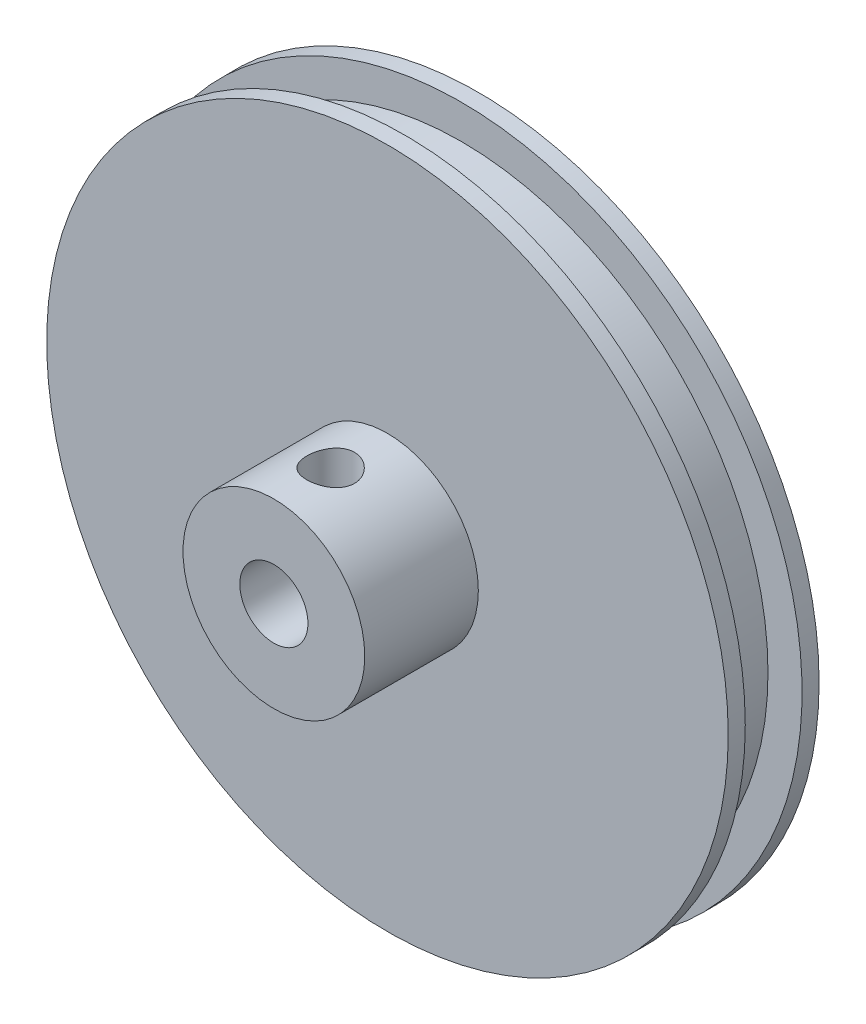
ISO-10303-21;
HEADER;
FILE_DESCRIPTION(('STEP AP214'),'2;1');
FILE_NAME('part.step','',(''),(''),'','','');
FILE_SCHEMA(('AUTOMOTIVE_DESIGN { 1 0 10303 214 1 1 1 1 }'));
ENDSEC;
DATA;
#1=APPLICATION_CONTEXT('core data for automotive mechanical design processes');
#2=APPLICATION_PROTOCOL_DEFINITION('international standard','automotive_design',2000,#1);
#3=PRODUCT_CONTEXT('',#1,'mechanical');
#4=PRODUCT('Part','Part','',(#3));
#5=PRODUCT_RELATED_PRODUCT_CATEGORY('part','',(#4));
#6=PRODUCT_DEFINITION_FORMATION('','',#4);
#7=PRODUCT_DEFINITION_CONTEXT('part definition',#1,'design');
#8=PRODUCT_DEFINITION('design','',#6,#7);
#9=PRODUCT_DEFINITION_SHAPE('','',#8);
#10=(LENGTH_UNIT() NAMED_UNIT(*) SI_UNIT(.MILLI.,.METRE.));
#11=(NAMED_UNIT(*) PLANE_ANGLE_UNIT() SI_UNIT($,.RADIAN.));
#12=(NAMED_UNIT(*) SI_UNIT($,.STERADIAN.) SOLID_ANGLE_UNIT());
#13=UNCERTAINTY_MEASURE_WITH_UNIT(LENGTH_MEASURE(1.E-05),#10,'distance_accuracy_value','');
#14=(GEOMETRIC_REPRESENTATION_CONTEXT(3) GLOBAL_UNCERTAINTY_ASSIGNED_CONTEXT((#13)) GLOBAL_UNIT_ASSIGNED_CONTEXT((#10,
#11,#12)) REPRESENTATION_CONTEXT('',''));
#15=CARTESIAN_POINT('',(0.,0.,0.));
#16=DIRECTION('',(0.,0.,1.));
#17=DIRECTION('',(1.,0.,0.));
#18=AXIS2_PLACEMENT_3D('',#15,#16,#17);
#19=CARTESIAN_POINT('',(0.,0.,8.));
#20=DIRECTION('',(0.,0.,-1.));
#21=DIRECTION('',(-1.,0.,0.));
#22=AXIS2_PLACEMENT_3D('',#19,#20,#21);
#23=CYLINDRICAL_SURFACE('',#22,30.);
#24=CARTESIAN_POINT('',(0.,0.,1.5));
#25=DIRECTION('',(0.,0.,-1.));
#26=DIRECTION('',(-1.,0.,0.));
#27=AXIS2_PLACEMENT_3D('',#24,#25,#26);
#28=CIRCLE('',#27,30.);
#29=CARTESIAN_POINT('',(-30.,0.,1.5));
#30=VERTEX_POINT('',#29);
#31=EDGE_CURVE('E53',#30,#30,#28,.T.);
#32=ORIENTED_EDGE('',*,*,#31,.T.);
#33=EDGE_LOOP('',(#32));
#34=FACE_BOUND('',#33,.T.);
#35=CARTESIAN_POINT('',(0.,0.,0.));
#36=DIRECTION('',(0.,0.,1.));
#37=DIRECTION('',(1.,0.,0.));
#38=AXIS2_PLACEMENT_3D('',#35,#36,#37);
#39=CIRCLE('',#38,30.);
#40=CARTESIAN_POINT('',(30.,0.,0.));
#41=VERTEX_POINT('',#40);
#42=EDGE_CURVE('E64',#41,#41,#39,.T.);
#43=ORIENTED_EDGE('',*,*,#42,.T.);
#44=EDGE_LOOP('',(#43));
#45=FACE_BOUND('',#44,.T.);
#46=ADVANCED_FACE('F49',(#34,#45),#23,.T.);
#47=CARTESIAN_POINT('',(0.,0.,6.5));
#48=DIRECTION('',(0.,0.,1.));
#49=DIRECTION('',(1.,0.,0.));
#50=AXIS2_PLACEMENT_3D('',#47,#48,#49);
#51=CIRCLE('',#50,30.);
#52=CARTESIAN_POINT('',(30.,0.,6.5));
#53=VERTEX_POINT('',#52);
#54=EDGE_CURVE('E72',#53,#53,#51,.T.);
#55=ORIENTED_EDGE('',*,*,#54,.T.);
#56=EDGE_LOOP('',(#55));
#57=FACE_BOUND('',#56,.T.);
#58=CARTESIAN_POINT('',(0.,0.,8.));
#59=DIRECTION('',(0.,0.,1.));
#60=DIRECTION('',(1.,0.,0.));
#61=AXIS2_PLACEMENT_3D('',#58,#59,#60);
#62=CIRCLE('',#61,30.);
#63=CARTESIAN_POINT('',(30.,0.,8.));
#64=VERTEX_POINT('',#63);
#65=EDGE_CURVE('E58',#64,#64,#62,.T.);
#66=ORIENTED_EDGE('',*,*,#65,.F.);
#67=EDGE_LOOP('',(#66));
#68=FACE_BOUND('',#67,.T.);
#69=ADVANCED_FACE('F51',(#57,#68),#23,.T.);
#70=CARTESIAN_POINT('',(0.,0.,8.));
#71=DIRECTION('',(0.,0.,1.));
#72=DIRECTION('',(1.,0.,0.));
#73=AXIS2_PLACEMENT_3D('',#70,#71,#72);
#74=PLANE('',#73);
#75=CARTESIAN_POINT('',(0.,0.,8.));
#76=DIRECTION('',(0.,0.,1.));
#77=DIRECTION('',(1.,0.,0.));
#78=AXIS2_PLACEMENT_3D('',#75,#76,#77);
#79=CIRCLE('',#78,8.);
#80=CARTESIAN_POINT('',(8.,0.,8.));
#81=VERTEX_POINT('',#80);
#82=EDGE_CURVE('E11',#81,#81,#79,.T.);
#83=ORIENTED_EDGE('',*,*,#82,.F.);
#84=EDGE_LOOP('',(#83));
#85=FACE_BOUND('',#84,.T.);
#86=ORIENTED_EDGE('',*,*,#65,.T.);
#87=EDGE_LOOP('',(#86));
#88=FACE_BOUND('',#87,.T.);
#89=ADVANCED_FACE('F133',(#85,#88),#74,.T.);
#90=CARTESIAN_POINT('',(0.,0.,0.));
#91=DIRECTION('',(0.,0.,1.));
#92=DIRECTION('',(1.,0.,0.));
#93=AXIS2_PLACEMENT_3D('',#90,#91,#92);
#94=PLANE('',#93);
#95=CARTESIAN_POINT('',(0.,0.,0.));
#96=DIRECTION('',(0.,0.,1.));
#97=DIRECTION('',(1.,0.,0.));
#98=AXIS2_PLACEMENT_3D('',#95,#96,#97);
#99=CIRCLE('',#98,3.);
#100=CARTESIAN_POINT('',(3.,0.,0.));
#101=VERTEX_POINT('',#100);
#102=EDGE_CURVE('E163',#101,#101,#99,.T.);
#103=ORIENTED_EDGE('',*,*,#102,.T.);
#104=EDGE_LOOP('',(#103));
#105=FACE_BOUND('',#104,.T.);
#106=ORIENTED_EDGE('',*,*,#42,.F.);
#107=EDGE_LOOP('',(#106));
#108=FACE_BOUND('',#107,.T.);
#109=ADVANCED_FACE('F138',(#105,#108),#94,.F.);
#110=CARTESIAN_POINT('',(0.,0.,18.));
#111=DIRECTION('',(0.,0.,-1.));
#112=DIRECTION('',(-1.,0.,0.));
#113=AXIS2_PLACEMENT_3D('',#110,#111,#112);
#114=CYLINDRICAL_SURFACE('',#113,8.);
#115=CARTESIAN_POINT('',(-2.10611885965794,7.71778876032463,13.));
#116=CARTESIAN_POINT('',(-2.10611593603416,7.71779083037099,12.8842440364444));
#117=CARTESIAN_POINT('',(-2.09651731243442,7.72042853052437,12.7684567648006));
#118=CARTESIAN_POINT('',(-2.05844605551307,7.73066461518365,12.5402213319275));
#119=CARTESIAN_POINT('',(-2.02996356893785,7.73826558940368,12.4277749459308));
#120=CARTESIAN_POINT('',(-1.95512090184782,7.75751131254223,12.2095558606227));
#121=CARTESIAN_POINT('',(-1.90878532998448,7.7691504930181,12.103774207166));
#122=CARTESIAN_POINT('',(-1.79962758395047,7.79515719027073,11.9014721397355));
#123=CARTESIAN_POINT('',(-1.73680427553817,7.80952489473216,11.8049523635386));
#124=CARTESIAN_POINT('',(-1.59482533800342,7.83976409858205,11.6215739970658));
#125=CARTESIAN_POINT('',(-1.51534228717463,7.85566163210705,11.5349731503495));
#126=CARTESIAN_POINT('',(-1.34300335499517,7.88695124472672,11.3761674013107));
#127=CARTESIAN_POINT('',(-1.25014612457769,7.90234327263797,11.3039639530222));
#128=CARTESIAN_POINT('',(-1.05191218091972,7.93118221700837,11.1749329893151));
#129=CARTESIAN_POINT('',(-0.94636384005828,7.94459531529715,11.1183609369056));
#130=CARTESIAN_POINT('',(-0.726843306551775,7.96767598247521,11.0238633941039));
#131=CARTESIAN_POINT('',(-0.612872492195318,7.97734416258936,10.9859348605473));
#132=CARTESIAN_POINT('',(-0.382430923024965,7.99166889495782,10.9306329796959));
#133=CARTESIAN_POINT('',(-0.266072084273707,7.99643209072107,10.9128213812563));
#134=CARTESIAN_POINT('',(-0.0319263328954628,8.00079257315074,10.8968809695057));
#135=CARTESIAN_POINT('',(0.0858603447399066,8.00039069864785,10.8987489601317));
#136=CARTESIAN_POINT('',(0.316470528685519,7.99455029662776,10.9218043997722));
#137=CARTESIAN_POINT('',(0.429344975437609,7.98923512964396,10.9425184706697));
#138=CARTESIAN_POINT('',(0.649959423051567,7.97432030195631,11.0019143022338));
#139=CARTESIAN_POINT('',(0.757699135443025,7.96472040084852,11.0405970710766));
#140=CARTESIAN_POINT('',(0.966203601972375,7.94213851572665,11.1352001799814));
#141=CARTESIAN_POINT('',(1.06689043870507,7.92912458538059,11.1912843086315));
#142=CARTESIAN_POINT('',(1.25758786242909,7.90112495892233,11.3189727843245));
#143=CARTESIAN_POINT('',(1.34759641966305,7.88613888907856,11.3905800747634));
#144=CARTESIAN_POINT('',(1.51720672687194,7.85530037034182,11.5498014980189));
#145=CARTESIAN_POINT('',(1.59641885989787,7.83943541085153,11.6378287191427));
#146=CARTESIAN_POINT('',(1.73904875830948,7.80903594493344,11.8260808163805));
#147=CARTESIAN_POINT('',(1.80246562129063,7.7945015145505,11.9263063889155));
#148=CARTESIAN_POINT('',(1.91198826987529,7.76836559186465,12.1369343288459));
#149=CARTESIAN_POINT('',(1.95799125688072,7.75678164439852,12.247392480406));
#150=CARTESIAN_POINT('',(2.03064475917892,7.73808146464248,12.4748540581175));
#151=CARTESIAN_POINT('',(2.05729990325061,7.73096416380702,12.5918559115342));
#152=CARTESIAN_POINT('',(2.08983520797632,7.72223196128711,12.8254475449143));
#153=CARTESIAN_POINT('',(2.09629539062858,7.72046348508539,12.9419508882309));
#154=CARTESIAN_POINT('',(2.08985275001794,7.72220997984579,13.1743723512661));
#155=CARTESIAN_POINT('',(2.07695191522604,7.72572440822787,13.2902905298571));
#156=CARTESIAN_POINT('',(2.03266433815781,7.73749177984536,13.5160376710957));
#157=CARTESIAN_POINT('',(2.00162344466205,7.74565600044142,13.6259395583753));
#158=CARTESIAN_POINT('',(1.9223249017826,7.76571497017705,13.838978996403));
#159=CARTESIAN_POINT('',(1.87406505615576,7.77761019517541,13.9421156822756));
#160=CARTESIAN_POINT('',(1.76051249557696,7.804104954312,14.1411311339708));
#161=CARTESIAN_POINT('',(1.69487762615926,7.8187568767749,14.2368075410799));
#162=CARTESIAN_POINT('',(1.54886546673231,7.84898484772338,14.4160033598884));
#163=CARTESIAN_POINT('',(1.46848549459947,7.86456106398803,14.4995205548705));
#164=CARTESIAN_POINT('',(1.29258847896621,7.89540326605623,14.6544195508956));
#165=CARTESIAN_POINT('',(1.19671168724163,7.91064847257701,14.7253977756426));
#166=CARTESIAN_POINT('',(0.994068276838299,7.9386569744585,14.8502527610098));
#167=CARTESIAN_POINT('',(0.887302236917366,7.95142040161978,14.9041304298903));
#168=CARTESIAN_POINT('',(0.666661870482597,7.97293818645152,14.9927663474238));
#169=CARTESIAN_POINT('',(0.55284749448831,7.98172217124312,15.0276662899873));
#170=CARTESIAN_POINT('',(0.320706449809214,7.99441326618079,15.0777711554553));
#171=CARTESIAN_POINT('',(0.202380753406219,7.99832142111316,15.0929802977043));
#172=CARTESIAN_POINT('',(-0.0316481468022682,8.00076800448047,15.1030143387478));
#173=CARTESIAN_POINT('',(-0.147324662666938,7.99946270175496,15.098432125983));
#174=CARTESIAN_POINT('',(-0.37619545435328,7.99197021363607,15.0703853950062));
#175=CARTESIAN_POINT('',(-0.489389818121485,7.98578320149747,15.0469215469141));
#176=CARTESIAN_POINT('',(-0.709393949636194,7.96924477818465,14.9821085817812));
#177=CARTESIAN_POINT('',(-0.816240361166675,7.95892063341483,14.9408764378317));
#178=CARTESIAN_POINT('',(-1.02155691009666,7.9351820841317,14.8418020599263));
#179=CARTESIAN_POINT('',(-1.12002589915758,7.92176725689336,14.783957553564));
#180=CARTESIAN_POINT('',(-1.30856638601103,7.89284453098574,14.65154658094));
#181=CARTESIAN_POINT('',(-1.39835318056205,7.8772913011799,14.5765846460611));
#182=CARTESIAN_POINT('',(-1.5642736297147,7.84603030690711,14.4128212896994));
#183=CARTESIAN_POINT('',(-1.64040372098833,7.83032250323299,14.3240162675208));
#184=CARTESIAN_POINT('',(-1.7784395201366,7.8001449754068,14.1328304414933));
#185=CARTESIAN_POINT('',(-1.84001080593285,7.78570841092911,14.0302025036915));
#186=CARTESIAN_POINT('',(-1.94493917363777,7.76016414815561,13.8156850713263));
#187=CARTESIAN_POINT('',(-1.98830851680539,7.74905421041565,13.7038018723385));
#188=CARTESIAN_POINT('',(-2.04972444100542,7.73301049608083,13.4935616327421));
#189=CARTESIAN_POINT('',(-2.07082364889355,7.7273475927386,13.3961411940639));
#190=CARTESIAN_POINT('',(-2.09902137315844,7.71973603142663,13.199154742253));
#191=CARTESIAN_POINT('',(-2.10612137495509,7.71778697939038,13.099588957891));
#192=CARTESIAN_POINT('',(-2.10611885965794,7.71778876032463,13.));
#193=B_SPLINE_CURVE_WITH_KNOTS('',3,(#115,#116,#117,#118,#119,#120,#121,#122,#123,#124,#125,
#126,#127,#128,#129,#130,#131,#132,#133,#134,#135,#136,#137,#138,#139,#140,#141,#142,#143,#144,
#145,#146,#147,#148,#149,#150,#151,#152,#153,#154,#155,#156,#157,#158,#159,#160,#161,#162,#163,
#164,#165,#166,#167,#168,#169,#170,#171,#172,#173,#174,#175,#176,#177,#178,#179,#180,#181,#182,
#183,#184,#185,#186,#187,#188,#189,#190,#191,#192),.UNSPECIFIED.,.T.,.F.,(4,2,2,2,2,2,2,2,2,2,2,
2,2,2,2,2,2,2,2,2,2,2,2,2,2,2,2,2,2,2,2,2,2,2,2,2,2,2,4),(0.,0.346901812495412,
0.693984774601701,1.04059102006554,1.38722111588191,1.74143920947592,2.0956930584579,
2.45543360174608,2.81511540540188,3.16680047974519,3.51842843956861,3.8614608951439,
4.20451259968872,4.55089656276601,4.89734626234308,5.25411055949775,5.61089523439248,
5.96975442024491,6.32852772428482,6.6768972656967,7.02523103030441,7.36713083024463,
7.70907425442379,8.05832960560818,8.40764854919863,8.76671324559394,9.12575886782476,
9.48208558579399,9.83833593743032,10.1839893363922,10.52963046846,10.8730301112332,
11.2164767500635,11.5688480068,11.9213110714784,12.2812190642816,12.6408842239052,
12.9393678205879,13.237819744236),.UNSPECIFIED.);
#194=CARTESIAN_POINT('',(-2.10611885965794,7.71778876032463,13.));
#195=VERTEX_POINT('',#194);
#196=EDGE_CURVE('E99',#195,#195,#193,.T.);
#197=ORIENTED_EDGE('',*,*,#196,.T.);
#198=EDGE_LOOP('',(#197));
#199=FACE_BOUND('',#198,.T.);
#200=CARTESIAN_POINT('',(0.,0.,18.));
#201=DIRECTION('',(0.,0.,1.));
#202=DIRECTION('',(1.,0.,0.));
#203=AXIS2_PLACEMENT_3D('',#200,#201,#202);
#204=CIRCLE('',#203,8.);
#205=CARTESIAN_POINT('',(8.,0.,18.));
#206=VERTEX_POINT('',#205);
#207=EDGE_CURVE('E67',#206,#206,#204,.T.);
#208=ORIENTED_EDGE('',*,*,#207,.F.);
#209=EDGE_LOOP('',(#208));
#210=FACE_BOUND('',#209,.T.);
#211=ORIENTED_EDGE('',*,*,#82,.T.);
#212=EDGE_LOOP('',(#211));
#213=FACE_BOUND('',#212,.T.);
#214=ADVANCED_FACE('F140',(#199,#210,#213),#114,.T.);
#215=CARTESIAN_POINT('',(0.,0.,18.));
#216=DIRECTION('',(0.,0.,1.));
#217=DIRECTION('',(1.,0.,0.));
#218=AXIS2_PLACEMENT_3D('',#215,#216,#217);
#219=PLANE('',#218);
#220=CARTESIAN_POINT('',(0.,0.,18.));
#221=DIRECTION('',(0.,0.,1.));
#222=DIRECTION('',(1.,0.,0.));
#223=AXIS2_PLACEMENT_3D('',#220,#221,#222);
#224=CIRCLE('',#223,3.);
#225=CARTESIAN_POINT('',(3.,0.,18.));
#226=VERTEX_POINT('',#225);
#227=EDGE_CURVE('E166',#226,#226,#224,.T.);
#228=ORIENTED_EDGE('',*,*,#227,.F.);
#229=EDGE_LOOP('',(#228));
#230=FACE_BOUND('',#229,.T.);
#231=ORIENTED_EDGE('',*,*,#207,.T.);
#232=EDGE_LOOP('',(#231));
#233=FACE_BOUND('',#232,.T.);
#234=ADVANCED_FACE('F146',(#230,#233),#219,.T.);
#235=CARTESIAN_POINT('',(0.,0.,0.));
#236=DIRECTION('',(0.,0.,1.));
#237=DIRECTION('',(1.,0.,0.));
#238=AXIS2_PLACEMENT_3D('',#235,#236,#237);
#239=CYLINDRICAL_SURFACE('',#238,3.);
#240=CARTESIAN_POINT('',(-2.10169772838254,2.14076310191289,13.));
#241=CARTESIAN_POINT('',(-2.10169375625308,2.14077095929547,13.1008011820973));
#242=CARTESIAN_POINT('',(-2.0943777365906,2.14802399069996,13.2016245271775));
#243=CARTESIAN_POINT('',(-2.06580578254674,2.17550153151482,13.3995326047588));
#244=CARTESIAN_POINT('',(-2.04451885433035,2.19575487934358,13.4966085155702));
#245=CARTESIAN_POINT('',(-1.989826644943,2.24542254760898,13.6834179233112));
#246=CARTESIAN_POINT('',(-1.95655740396004,2.27473352259943,13.7732205078483));
#247=CARTESIAN_POINT('',(-1.87921648582915,2.33903269019606,13.9457598105775));
#248=CARTESIAN_POINT('',(-1.83514405636555,2.37402127812416,14.028496036139));
#249=CARTESIAN_POINT('',(-1.7284886346901,2.45305175646765,14.2004173764852));
#250=CARTESIAN_POINT('',(-1.66401563321749,2.49760605595852,14.28819447928));
#251=CARTESIAN_POINT('',(-1.5221850485206,2.58649910184219,14.4529364017925));
#252=CARTESIAN_POINT('',(-1.44481160285715,2.63083751283466,14.5298876925825));
#253=CARTESIAN_POINT('',(-1.26389150089555,2.72296200972067,14.683558806651));
#254=CARTESIAN_POINT('',(-1.15813195461536,2.77009251387542,14.7581057788012));
#255=CARTESIAN_POINT('',(-0.931671508274706,2.85420493631398,14.8876232166201));
#256=CARTESIAN_POINT('',(-0.811001150578626,2.89120711660961,14.9426328339596));
#257=CARTESIAN_POINT('',(-0.592302754480655,2.94248262909899,15.0177936503767));
#258=CARTESIAN_POINT('',(-0.496921123709963,2.96019286391941,15.0433418796575));
#259=CARTESIAN_POINT('',(-0.302297708924922,2.98633968063089,15.0808262292855));
#260=CARTESIAN_POINT('',(-0.203059072683437,2.99478366689801,15.0927732182547));
#261=CARTESIAN_POINT('',(-0.00334668391707819,3.00166500770866,15.1023830942073));
#262=CARTESIAN_POINT('',(0.0971290903940952,3.00008292758235,15.1000182393086));
#263=CARTESIAN_POINT('',(0.296082205810905,2.98701861494219,15.0810856725687));
#264=CARTESIAN_POINT('',(0.394558981793993,2.97553362166874,15.0645140001219));
#265=CARTESIAN_POINT('',(0.584576344512786,2.94403548145534,15.01863278519));
#266=CARTESIAN_POINT('',(0.676223930127029,2.92422291691091,14.9896225343755));
#267=CARTESIAN_POINT('',(0.853158440344672,2.87758624655556,14.9202242192872));
#268=CARTESIAN_POINT('',(0.938444111227793,2.85076076340055,14.8798339198393));
#269=CARTESIAN_POINT('',(1.1106277231926,2.78851216003814,14.7839178739043));
#270=CARTESIAN_POINT('',(1.19663223251965,2.75246198658368,14.7272021615153));
#271=CARTESIAN_POINT('',(1.35844076373939,2.67631338332498,14.6029022739928));
#272=CARTESIAN_POINT('',(1.43423363633669,2.63621061104746,14.5353063934969));
#273=CARTESIAN_POINT('',(1.58758376775993,2.54730424683141,14.3774420434021));
#274=CARTESIAN_POINT('',(1.66303875167087,2.49822583097174,14.2852804059057));
#275=CARTESIAN_POINT('',(1.79793073853315,2.40296690080012,14.0884905044488));
#276=CARTESIAN_POINT('',(1.85737188046784,2.35678564005301,13.9838654719147));
#277=CARTESIAN_POINT('',(1.94674332255768,2.28314200159308,13.7885668890403));
#278=CARTESIAN_POINT('',(1.98032001950162,2.25382145811251,13.7002745145974));
#279=CARTESIAN_POINT('',(2.03565378050321,2.20397557657203,13.5177436758514));
#280=CARTESIAN_POINT('',(2.05743294918058,2.18343380538625,13.4235167035373));
#281=CARTESIAN_POINT('',(2.08796668237559,2.15426863963925,13.2300519695135));
#282=CARTESIAN_POINT('',(2.09658709695138,2.1457680639909,13.1307731233637));
#283=CARTESIAN_POINT('',(2.09954822424216,2.14287372119887,12.9318051712858));
#284=CARTESIAN_POINT('',(2.09389414282995,2.1484748112111,12.8321162281575));
#285=CARTESIAN_POINT('',(2.07063459635597,2.17086728230824,12.6498511717286));
#286=CARTESIAN_POINT('',(2.05479943351647,2.18599516640945,12.5668223220221));
#287=CARTESIAN_POINT('',(2.01387176754698,2.22375705786976,12.4048457954058));
#288=CARTESIAN_POINT('',(1.98876950460564,2.24639897621777,12.3259025215959));
#289=CARTESIAN_POINT('',(1.91640507741083,2.30880983478957,12.1369244178401));
#290=CARTESIAN_POINT('',(1.86427442517673,2.35162237335329,12.0297616470286));
#291=CARTESIAN_POINT('',(1.74397631825719,2.44217848124805,11.827087390352));
#292=CARTESIAN_POINT('',(1.67577751904419,2.48993158482319,11.7315992385862));
#293=CARTESIAN_POINT('',(1.52306039293768,2.58623223814499,11.5514749350504));
#294=CARTESIAN_POINT('',(1.43825837348485,2.63477777332761,11.4670775901343));
#295=CARTESIAN_POINT('',(1.25413457242381,2.72722001707938,11.3129662182214));
#296=CARTESIAN_POINT('',(1.15483444886402,2.7711234944079,11.2432306613411));
#297=CARTESIAN_POINT('',(0.960113484708132,2.84379633553161,11.1306777159149));
#298=CARTESIAN_POINT('',(0.866644240334808,2.87386434744443,11.0853337683013));
#299=CARTESIAN_POINT('',(0.671960924430798,2.92550580592872,11.0084497261879));
#300=CARTESIAN_POINT('',(0.570751594797907,2.94708440445638,10.9769012583481));
#301=CARTESIAN_POINT('',(0.362469450150195,2.97989616732642,10.9291632722633));
#302=CARTESIAN_POINT('',(0.255366453608703,2.99106955374433,10.9130624851156));
#303=CARTESIAN_POINT('',(0.0393871031655785,3.0016861024953,10.8976300219915));
#304=CARTESIAN_POINT('',(-0.0694885424426377,3.00113384040131,10.8982918049581));
#305=CARTESIAN_POINT('',(-0.274659360758908,2.98899686411999,10.9154313910822));
#306=CARTESIAN_POINT('',(-0.371153578864251,2.97848336578262,10.9303747224434));
#307=CARTESIAN_POINT('',(-0.559872691938091,2.94884234528464,10.9730513419441));
#308=CARTESIAN_POINT('',(-0.652096771061705,2.9297131844595,11.000787063169));
#309=CARTESIAN_POINT('',(-0.833442165333657,2.88347741772419,11.0689638806384));
#310=CARTESIAN_POINT('',(-0.922341799693916,2.85611495838439,11.1098158121005));
#311=CARTESIAN_POINT('',(-1.09210503691423,2.79561079119742,11.2023613529238));
#312=CARTESIAN_POINT('',(-1.17296708084377,2.76246796563998,11.2540570594649));
#313=CARTESIAN_POINT('',(-1.3378567515662,2.68692966412416,11.3758294470539));
#314=CARTESIAN_POINT('',(-1.42040195623773,2.64389775662703,11.4475163415319));
#315=CARTESIAN_POINT('',(-1.57312651325334,2.5559856438556,11.6023216991642));
#316=CARTESIAN_POINT('',(-1.64327944110889,2.51110173483857,11.6854639331693));
#317=CARTESIAN_POINT('',(-1.78037255561428,2.41624502854759,11.8761664066015));
#318=CARTESIAN_POINT('',(-1.84507190039808,2.36658220450346,11.9855104090036));
#319=CARTESIAN_POINT('',(-1.95465871186137,2.27691294042418,12.2172646071013));
#320=CARTESIAN_POINT('',(-1.99960623719485,2.2368773975487,12.339633768005));
#321=CARTESIAN_POINT('',(-2.05544647225353,2.18542497843176,12.5527183704789));
#322=CARTESIAN_POINT('',(-2.07268491272056,2.16892260443222,12.6405261896245));
#323=CARTESIAN_POINT('',(-2.09580239388575,2.14659747292998,12.8188867639319));
#324=CARTESIAN_POINT('',(-2.10170129717146,2.14075604238972,12.9094344367022));
#325=CARTESIAN_POINT('',(-2.10169772838254,2.14076310191289,13.));
#326=B_SPLINE_CURVE_WITH_KNOTS('',3,(#240,#241,#242,#243,#244,#245,#246,#247,#248,#249,#250,
#251,#252,#253,#254,#255,#256,#257,#258,#259,#260,#261,#262,#263,#264,#265,#266,#267,#268,#269,
#270,#271,#272,#273,#274,#275,#276,#277,#278,#279,#280,#281,#282,#283,#284,#285,#286,#287,#288,
#289,#290,#291,#292,#293,#294,#295,#296,#297,#298,#299,#300,#301,#302,#303,#304,#305,#306,#307,
#308,#309,#310,#311,#312,#313,#314,#315,#316,#317,#318,#319,#320,#321,#322,#323,#324,#325),
.UNSPECIFIED.,.T.,.F.,(4,2,2,2,2,2,2,2,2,2,2,2,2,2,2,2,2,2,2,2,2,2,2,2,2,2,2,2,2,2,2,2,2,2,2,2,
2,2,2,2,2,2,4),(0.,0.301973223435531,0.604618635711374,0.903931039140894,1.20326429210161,
1.55501769378841,1.90720684651705,2.31804977810942,2.7280646973405,3.02773360434289,
3.32716288032115,3.62717275157127,3.92726628739669,4.22051205037771,4.51381545043928,
4.84003888345372,5.16661565707934,5.55151589746291,5.9363165597808,6.23199289437156,
6.52711329718778,6.82522273911174,7.12322347697783,7.37980613638279,7.63665979487589,
8.01451127327345,8.39310602933113,8.77884561454897,9.16401474783142,9.48714146722313,
9.8100717876306,10.134846099452,10.4594936804375,10.7527707598947,11.0461036430495,
11.3497065387119,11.6533682052277,12.0045164637744,12.3564046795999,12.7636402272856,
13.1696287925793,13.4414153585327,13.7127254216916),.UNSPECIFIED.);
#327=CARTESIAN_POINT('',(-2.10169772838254,2.14076310191289,13.));
#328=VERTEX_POINT('',#327);
#329=EDGE_CURVE('E81',#328,#328,#326,.T.);
#330=ORIENTED_EDGE('',*,*,#329,.T.);
#331=EDGE_LOOP('',(#330));
#332=FACE_BOUND('',#331,.T.);
#333=ORIENTED_EDGE('',*,*,#102,.F.);
#334=EDGE_LOOP('',(#333));
#335=FACE_BOUND('',#334,.T.);
#336=ORIENTED_EDGE('',*,*,#227,.T.);
#337=EDGE_LOOP('',(#336));
#338=FACE_BOUND('',#337,.T.);
#339=ADVANCED_FACE('F112',(#332,#335,#338),#239,.F.);
#340=CARTESIAN_POINT('',(-0.00634191794263367,7.99999748625441,13.));
#341=DIRECTION('',(-0.000792739742829222,0.999999685781801,0.));
#342=DIRECTION('',(-0.999999685781801,-0.000792739742829222,0.));
#343=AXIS2_PLACEMENT_3D('',#340,#341,#342);
#344=CYLINDRICAL_SURFACE('',#343,2.09999999999999);
#345=ORIENTED_EDGE('',*,*,#329,.F.);
#346=EDGE_LOOP('',(#345));
#347=FACE_BOUND('',#346,.T.);
#348=ORIENTED_EDGE('',*,*,#196,.F.);
#349=EDGE_LOOP('',(#348));
#350=FACE_BOUND('',#349,.T.);
#351=ADVANCED_FACE('F107',(#347,#350),#344,.F.);
#352=CARTESIAN_POINT('',(-33.,0.,1.5));
#353=DIRECTION('',(0.,0.,-1.));
#354=DIRECTION('',(-1.,0.,0.));
#355=AXIS2_PLACEMENT_3D('',#352,#353,#354);
#356=PLANE('',#355);
#357=CARTESIAN_POINT('',(0.,0.,1.5));
#358=DIRECTION('',(0.,0.,-1.));
#359=DIRECTION('',(-1.,0.,0.));
#360=AXIS2_PLACEMENT_3D('',#357,#358,#359);
#361=CIRCLE('',#360,27.);
#362=CARTESIAN_POINT('',(-27.,0.,1.5));
#363=VERTEX_POINT('',#362);
#364=EDGE_CURVE('E75',#363,#363,#361,.T.);
#365=ORIENTED_EDGE('',*,*,#364,.T.);
#366=EDGE_LOOP('',(#365));
#367=FACE_BOUND('',#366,.T.);
#368=ORIENTED_EDGE('',*,*,#31,.F.);
#369=EDGE_LOOP('',(#368));
#370=FACE_BOUND('',#369,.T.);
#371=ADVANCED_FACE('F111',(#367,#370),#356,.F.);
#372=CARTESIAN_POINT('',(-33.,0.,6.5));
#373=DIRECTION('',(0.,0.,1.));
#374=DIRECTION('',(1.,0.,0.));
#375=AXIS2_PLACEMENT_3D('',#372,#373,#374);
#376=PLANE('',#375);
#377=CARTESIAN_POINT('',(0.,0.,6.5));
#378=DIRECTION('',(0.,0.,-1.));
#379=DIRECTION('',(-1.,0.,0.));
#380=AXIS2_PLACEMENT_3D('',#377,#378,#379);
#381=CIRCLE('',#380,27.);
#382=CARTESIAN_POINT('',(-27.,0.,6.5));
#383=VERTEX_POINT('',#382);
#384=EDGE_CURVE('E83',#383,#383,#381,.T.);
#385=ORIENTED_EDGE('',*,*,#384,.F.);
#386=EDGE_LOOP('',(#385));
#387=FACE_BOUND('',#386,.T.);
#388=ORIENTED_EDGE('',*,*,#54,.F.);
#389=EDGE_LOOP('',(#388));
#390=FACE_BOUND('',#389,.T.);
#391=ADVANCED_FACE('F118',(#387,#390),#376,.F.);
#392=CARTESIAN_POINT('',(0.,0.,0.));
#393=DIRECTION('',(0.,0.,-1.));
#394=DIRECTION('',(-1.,0.,0.));
#395=AXIS2_PLACEMENT_3D('',#392,#393,#394);
#396=CYLINDRICAL_SURFACE('',#395,27.);
#397=ORIENTED_EDGE('',*,*,#364,.F.);
#398=EDGE_LOOP('',(#397));
#399=FACE_BOUND('',#398,.T.);
#400=ORIENTED_EDGE('',*,*,#384,.T.);
#401=EDGE_LOOP('',(#400));
#402=FACE_BOUND('',#401,.T.);
#403=ADVANCED_FACE('F114',(#399,#402),#396,.T.);
#404=CLOSED_SHELL('',(#46,#69,#89,#109,#214,#234,#339,#351,#371,#391,#403));
#405=MANIFOLD_SOLID_BREP('B2',#404);
#406=ADVANCED_BREP_SHAPE_REPRESENTATION('',(#18,#405),#14);
#407=SHAPE_DEFINITION_REPRESENTATION(#9,#406);
ENDSEC;
END-ISO-10303-21;
